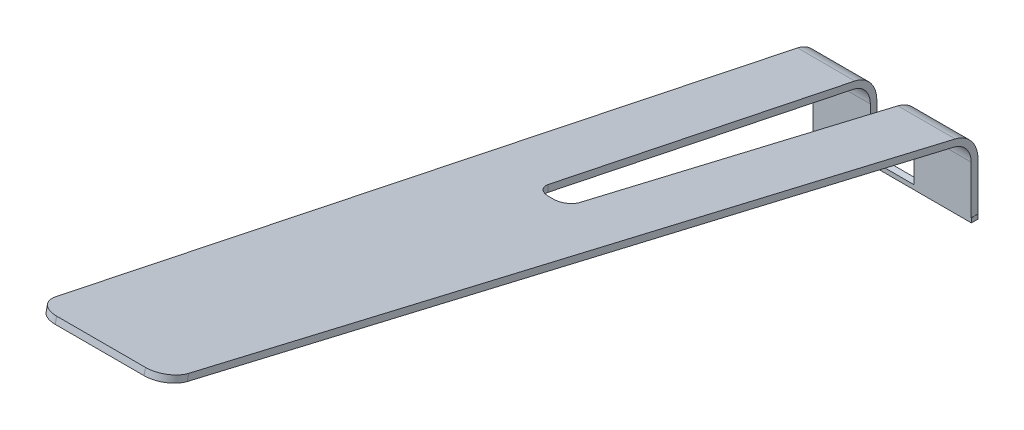
ISO-10303-21;
HEADER;
FILE_DESCRIPTION(('STEP AP214'),'2;1');
FILE_NAME('part.step','',(''),(''),'','','');
FILE_SCHEMA(('AUTOMOTIVE_DESIGN { 1 0 10303 214 1 1 1 1 }'));
ENDSEC;
DATA;
#1=APPLICATION_CONTEXT('core data for automotive mechanical design processes');
#2=APPLICATION_PROTOCOL_DEFINITION('international standard','automotive_design',2000,#1);
#3=PRODUCT_CONTEXT('',#1,'mechanical');
#4=PRODUCT('Part','Part','',(#3));
#5=PRODUCT_RELATED_PRODUCT_CATEGORY('part','',(#4));
#6=PRODUCT_DEFINITION_FORMATION('','',#4);
#7=PRODUCT_DEFINITION_CONTEXT('part definition',#1,'design');
#8=PRODUCT_DEFINITION('design','',#6,#7);
#9=PRODUCT_DEFINITION_SHAPE('','',#8);
#10=(LENGTH_UNIT() NAMED_UNIT(*) SI_UNIT(.MILLI.,.METRE.));
#11=(NAMED_UNIT(*) PLANE_ANGLE_UNIT() SI_UNIT($,.RADIAN.));
#12=(NAMED_UNIT(*) SI_UNIT($,.STERADIAN.) SOLID_ANGLE_UNIT());
#13=UNCERTAINTY_MEASURE_WITH_UNIT(LENGTH_MEASURE(1.E-05),#10,'distance_accuracy_value','');
#14=(GEOMETRIC_REPRESENTATION_CONTEXT(3) GLOBAL_UNCERTAINTY_ASSIGNED_CONTEXT((#13)) GLOBAL_UNIT_ASSIGNED_CONTEXT((#10,
#11,#12)) REPRESENTATION_CONTEXT('',''));
#15=CARTESIAN_POINT('',(0.,0.,0.));
#16=DIRECTION('',(0.,0.,1.));
#17=DIRECTION('',(1.,0.,0.));
#18=AXIS2_PLACEMENT_3D('',#15,#16,#17);
#19=CARTESIAN_POINT('',(1.05,6.67729537923709,-5.19121403275844));
#20=DIRECTION('',(0.,0.9761154710916,-0.217252358089902));
#21=DIRECTION('',(0.,0.217252358089902,0.9761154710916));
#22=AXIS2_PLACEMENT_3D('',#19,#20,#21);
#23=PLANE('',#22);
#24=DIRECTION('',(1.,0.,0.));
#25=VECTOR('',#24,1.);
#26=CARTESIAN_POINT('',(1.05,10.5964173206637,12.4174121462865));
#27=LINE('',#26,#25);
#28=CARTESIAN_POINT('',(1.84150899269365,10.5964173206637,12.4174121462865));
#29=VERTEX_POINT('',#28);
#30=CARTESIAN_POINT('',(3.85849100730636,10.5964173206637,12.4174121462865));
#31=VERTEX_POINT('',#30);
#32=EDGE_CURVE('E340',#29,#31,#27,.T.);
#33=ORIENTED_EDGE('',*,*,#32,.T.);
#34=CARTESIAN_POINT('',(3.85849100730636,10.4877911416188,11.9293544107407));
#35=DIRECTION('',(0.,0.9761154710916,-0.217252358089902));
#36=DIRECTION('',(1.,1.12114736717854E-12,5.03731835225337E-12));
#37=AXIS2_PLACEMENT_3D('',#34,#35,#36);
#38=ELLIPSE('',#37,0.500003188485115,0.5);
#39=CARTESIAN_POINT('',(4.35842984223507,10.4895338929215,11.937184597367));
#40=VERTEX_POINT('',#39);
#41=EDGE_CURVE('E47',#31,#40,#38,.T.);
#42=ORIENTED_EDGE('',*,*,#41,.T.);
#43=DIRECTION('',(0.0160436685581371,-0.217224395987895,-0.975989837286686));
#44=VECTOR('',#43,1.);
#45=CARTESIAN_POINT('',(4.63906849786791,6.68980677690716,-5.13500028696481));
#46=LINE('',#45,#44);
#47=CARTESIAN_POINT('',(4.6399925594426,6.67729537923709,-5.19121403275844));
#48=VERTEX_POINT('',#47);
#49=EDGE_CURVE('E246',#40,#48,#46,.T.);
#50=ORIENTED_EDGE('',*,*,#49,.T.);
#51=DIRECTION('',(1.,0.,0.));
#52=VECTOR('',#51,1.);
#53=CARTESIAN_POINT('',(1.05,6.67729537923709,-5.19121403275844));
#54=LINE('',#53,#52);
#55=CARTESIAN_POINT('',(3.33858526311422,6.67729537923709,-5.19121403275844));
#56=VERTEX_POINT('',#55);
#57=EDGE_CURVE('E341',#56,#48,#54,.T.);
#58=ORIENTED_EDGE('',*,*,#57,.F.);
#59=DIRECTION('',(-0.0182991005216206,0.217215980799233,0.975952027819773));
#60=VECTOR('',#59,1.);
#61=CARTESIAN_POINT('',(3.33781891413591,6.68639217854486,-5.1503420872486));
#62=LINE('',#61,#60);
#63=CARTESIAN_POINT('',(3.20551954978455,8.25682653693007,1.9056240114911));
#64=VERTEX_POINT('',#63);
#65=EDGE_CURVE('E306',#56,#64,#62,.T.);
#66=ORIENTED_EDGE('',*,*,#65,.T.);
#67=CARTESIAN_POINT('',(2.90557227025905,8.25557481027011,1.9));
#68=DIRECTION('',(0.,0.9761154710916,-0.217252358089902));
#69=DIRECTION('',(0.,-0.217252358089902,-0.9761154710916));
#70=AXIS2_PLACEMENT_3D('',#67,#68,#69);
#71=ELLIPSE('',#70,0.307340687536186,0.3);
#72=CARTESIAN_POINT('',(2.90557227025905,8.32234529937432,2.2));
#73=VERTEX_POINT('',#72);
#74=EDGE_CURVE('E310',#64,#73,#71,.F.);
#75=ORIENTED_EDGE('',*,*,#74,.T.);
#76=DIRECTION('',(-1.,0.,0.));
#77=VECTOR('',#76,1.);
#78=CARTESIAN_POINT('',(1.05,8.32234529937432,2.2));
#79=LINE('',#78,#77);
#80=CARTESIAN_POINT('',(2.79442772974096,8.32234529937432,2.2));
#81=VERTEX_POINT('',#80);
#82=EDGE_CURVE('E267',#73,#81,#79,.T.);
#83=ORIENTED_EDGE('',*,*,#82,.T.);
#84=CARTESIAN_POINT('',(2.79442772974096,8.25557481027011,1.9));
#85=DIRECTION('',(0.,0.9761154710916,-0.217252358089902));
#86=DIRECTION('',(0.,-0.217252358089902,-0.9761154710916));
#87=AXIS2_PLACEMENT_3D('',#84,#85,#86);
#88=ELLIPSE('',#87,0.307340687536186,0.3);
#89=CARTESIAN_POINT('',(2.49448045021546,8.25682653693007,1.9056240114911));
#90=VERTEX_POINT('',#89);
#91=EDGE_CURVE('E271',#81,#90,#88,.F.);
#92=ORIENTED_EDGE('',*,*,#91,.T.);
#93=DIRECTION('',(-0.0182991005216208,-0.217215980799233,-0.975952027819773));
#94=VECTOR('',#93,1.);
#95=CARTESIAN_POINT('',(2.36097560037645,6.67208269310169,-5.21463464658947));
#96=LINE('',#95,#94);
#97=CARTESIAN_POINT('',(2.36141473688578,6.67729537923709,-5.19121403275844));
#98=VERTEX_POINT('',#97);
#99=EDGE_CURVE('E289',#90,#98,#96,.T.);
#100=ORIENTED_EDGE('',*,*,#99,.T.);
#101=CARTESIAN_POINT('',(1.0600074405574,6.67729537923709,-5.19121403275844));
#102=VERTEX_POINT('',#101);
#103=EDGE_CURVE('E345',#102,#98,#54,.T.);
#104=ORIENTED_EDGE('',*,*,#103,.F.);
#105=DIRECTION('',(0.0160436685581373,0.217224395987895,0.975989837286686));
#106=VECTOR('',#105,1.);
#107=CARTESIAN_POINT('',(1.0600048646492,6.67726050254406,-5.19137073384074));
#108=LINE('',#107,#106);
#109=CARTESIAN_POINT('',(1.34157015776494,10.4895338929215,11.937184597367));
#110=VERTEX_POINT('',#109);
#111=EDGE_CURVE('E255',#102,#110,#108,.T.);
#112=ORIENTED_EDGE('',*,*,#111,.T.);
#113=CARTESIAN_POINT('',(1.84150899269365,10.4877911416188,11.9293544107407));
#114=DIRECTION('',(0.,0.9761154710916,-0.217252358089902));
#115=DIRECTION('',(1.,-1.12114736717852E-12,-5.03731835225329E-12));
#116=AXIS2_PLACEMENT_3D('',#113,#114,#115);
#117=ELLIPSE('',#116,0.500003188485115,0.5);
#118=EDGE_CURVE('E54',#110,#29,#117,.T.);
#119=ORIENTED_EDGE('',*,*,#118,.T.);
#120=EDGE_LOOP('',(#33,#42,#50,#58,#66,#75,#83,#92,#100,#104,#112,#119));
#121=FACE_BOUND('',#120,.T.);
#122=ADVANCED_FACE('F38',(#121),#23,.T.);
#123=CARTESIAN_POINT('',(1.05,6.04282032302755,-5.05));
#124=DIRECTION('',(1.,0.,0.));
#125=DIRECTION('',(0.,0.,-1.));
#126=AXIS2_PLACEMENT_3D('',#123,#124,#125);
#127=CYLINDRICAL_SURFACE('',#126,0.650000000000001);
#128=DIRECTION('',(1.,0.,0.));
#129=VECTOR('',#128,1.);
#130=CARTESIAN_POINT('',(1.05,6.04282032302755,-5.7));
#131=LINE('',#130,#129);
#132=CARTESIAN_POINT('',(1.05164383561644,6.04282032302755,-5.7));
#133=VERTEX_POINT('',#132);
#134=CARTESIAN_POINT('',(2.351875,6.04282032302755,-5.7));
#135=VERTEX_POINT('',#134);
#136=EDGE_CURVE('E346',#133,#135,#131,.T.);
#137=ORIENTED_EDGE('',*,*,#136,.F.);
#138=CARTESIAN_POINT('',(1.06232876712329,6.04282032302755,-5.05));
#139=DIRECTION('',(-0.99986491759912,0.,0.0164361356317664));
#140=DIRECTION('',(0.0164361356317664,0.,0.99986491759912));
#141=AXIS2_PLACEMENT_3D('',#138,#139,#140);
#142=ELLIPSE('',#141,0.650087815422891,0.650000000000001);
#143=EDGE_CURVE('E259',#133,#102,#142,.F.);
#144=ORIENTED_EDGE('',*,*,#143,.T.);
#145=ORIENTED_EDGE('',*,*,#103,.T.);
#146=CARTESIAN_POINT('',(2.3640625,6.04282032302755,-5.05));
#147=DIRECTION('',(0.999824265084997,0.,-0.0187467049703437));
#148=DIRECTION('',(0.0187467049703437,0.,0.999824265084997));
#149=AXIS2_PLACEMENT_3D('',#146,#147,#148);
#150=ELLIPSE('',#149,0.650114247772075,0.650000000000001);
#151=EDGE_CURVE('E285',#98,#135,#150,.F.);
#152=ORIENTED_EDGE('',*,*,#151,.T.);
#153=EDGE_LOOP('',(#137,#144,#145,#152));
#154=FACE_BOUND('',#153,.T.);
#155=ADVANCED_FACE('F498',(#154),#127,.T.);
#156=ORIENTED_EDGE('',*,*,#57,.T.);
#157=CARTESIAN_POINT('',(4.63767123287671,6.04282032302755,-5.05));
#158=DIRECTION('',(0.99986491759912,0.,0.0164361356317661));
#159=DIRECTION('',(0.0164361356317661,0.,-0.99986491759912));
#160=AXIS2_PLACEMENT_3D('',#157,#158,#159);
#161=ELLIPSE('',#160,0.650087815422891,0.650000000000001);
#162=CARTESIAN_POINT('',(4.64835616438356,6.04282032302755,-5.7));
#163=VERTEX_POINT('',#162);
#164=EDGE_CURVE('E237',#48,#163,#161,.F.);
#165=ORIENTED_EDGE('',*,*,#164,.T.);
#166=CARTESIAN_POINT('',(3.348125,6.04282032302755,-5.7));
#167=VERTEX_POINT('',#166);
#168=EDGE_CURVE('E234',#167,#163,#131,.T.);
#169=ORIENTED_EDGE('',*,*,#168,.F.);
#170=CARTESIAN_POINT('',(3.3359375,6.04282032302755,-5.05));
#171=DIRECTION('',(-0.999824265084997,0.,-0.0187467049703435));
#172=DIRECTION('',(0.0187467049703435,0.,-0.999824265084997));
#173=AXIS2_PLACEMENT_3D('',#170,#171,#172);
#174=ELLIPSE('',#173,0.650114247772075,0.650000000000001);
#175=EDGE_CURVE('E302',#167,#56,#174,.F.);
#176=ORIENTED_EDGE('',*,*,#175,.T.);
#177=EDGE_LOOP('',(#156,#165,#169,#176));
#178=FACE_BOUND('',#177,.T.);
#179=ADVANCED_FACE('F496',(#178),#127,.T.);
#180=CARTESIAN_POINT('',(1.05,4.85,-5.7));
#181=DIRECTION('',(0.,0.,-1.));
#182=DIRECTION('',(0.,1.,0.));
#183=AXIS2_PLACEMENT_3D('',#180,#181,#182);
#184=PLANE('',#183);
#185=DIRECTION('',(1.,0.,0.));
#186=VECTOR('',#185,1.);
#187=CARTESIAN_POINT('',(1.05,4.95,-5.7));
#188=LINE('',#187,#186);
#189=CARTESIAN_POINT('',(1.05,4.95,-5.7));
#190=VERTEX_POINT('',#189);
#191=CARTESIAN_POINT('',(1.05164383561644,4.95,-5.7));
#192=VERTEX_POINT('',#191);
#193=EDGE_CURVE('E450',#190,#192,#188,.T.);
#194=ORIENTED_EDGE('',*,*,#193,.T.);
#195=DIRECTION('',(0.,1.,0.));
#196=VECTOR('',#195,1.);
#197=CARTESIAN_POINT('',(1.05164383561644,4.85,-5.7));
#198=LINE('',#197,#196);
#199=EDGE_CURVE('E263',#192,#133,#198,.T.);
#200=ORIENTED_EDGE('',*,*,#199,.T.);
#201=ORIENTED_EDGE('',*,*,#136,.T.);
#202=DIRECTION('',(0.,-1.,0.));
#203=VECTOR('',#202,1.);
#204=CARTESIAN_POINT('',(2.351875,4.85,-5.7));
#205=LINE('',#204,#203);
#206=CARTESIAN_POINT('',(2.351875,4.95,-5.7));
#207=VERTEX_POINT('',#206);
#208=EDGE_CURVE('E281',#135,#207,#205,.T.);
#209=ORIENTED_EDGE('',*,*,#208,.T.);
#210=DIRECTION('',(1.,0.,0.));
#211=VECTOR('',#210,1.);
#212=CARTESIAN_POINT('',(1.05,4.95,-5.7));
#213=LINE('',#212,#211);
#214=CARTESIAN_POINT('',(3.348125,4.95,-5.7));
#215=VERTEX_POINT('',#214);
#216=EDGE_CURVE('E314',#207,#215,#213,.T.);
#217=ORIENTED_EDGE('',*,*,#216,.T.);
#218=DIRECTION('',(0.,1.,0.));
#219=VECTOR('',#218,1.);
#220=CARTESIAN_POINT('',(3.348125,4.85,-5.7));
#221=LINE('',#220,#219);
#222=EDGE_CURVE('E299',#215,#167,#221,.T.);
#223=ORIENTED_EDGE('',*,*,#222,.T.);
#224=ORIENTED_EDGE('',*,*,#168,.T.);
#225=DIRECTION('',(0.,-1.,0.));
#226=VECTOR('',#225,1.);
#227=CARTESIAN_POINT('',(4.64835616438356,4.85,-5.7));
#228=LINE('',#227,#226);
#229=CARTESIAN_POINT('',(4.64835616438356,4.95,-5.7));
#230=VERTEX_POINT('',#229);
#231=EDGE_CURVE('E221',#163,#230,#228,.T.);
#232=ORIENTED_EDGE('',*,*,#231,.T.);
#233=DIRECTION('',(1.,0.,0.));
#234=VECTOR('',#233,1.);
#235=CARTESIAN_POINT('',(1.05,4.95,-5.7));
#236=LINE('',#235,#234);
#237=CARTESIAN_POINT('',(4.65,4.95,-5.7));
#238=VERTEX_POINT('',#237);
#239=EDGE_CURVE('E202',#230,#238,#236,.T.);
#240=ORIENTED_EDGE('',*,*,#239,.T.);
#241=DIRECTION('',(0.,1.,0.));
#242=VECTOR('',#241,1.);
#243=CARTESIAN_POINT('',(4.65,4.85,-5.7));
#244=LINE('',#243,#242);
#245=CARTESIAN_POINT('',(4.65,4.85,-5.7));
#246=VERTEX_POINT('',#245);
#247=EDGE_CURVE('E326',#246,#238,#244,.T.);
#248=ORIENTED_EDGE('',*,*,#247,.F.);
#249=DIRECTION('',(1.,0.,0.));
#250=VECTOR('',#249,1.);
#251=CARTESIAN_POINT('',(1.05,4.85,-5.7));
#252=LINE('',#251,#250);
#253=CARTESIAN_POINT('',(1.05,4.85,-5.7));
#254=VERTEX_POINT('',#253);
#255=EDGE_CURVE('E349',#254,#246,#252,.T.);
#256=ORIENTED_EDGE('',*,*,#255,.F.);
#257=DIRECTION('',(0.,1.,0.));
#258=VECTOR('',#257,1.);
#259=CARTESIAN_POINT('',(1.05,4.85,-5.7));
#260=LINE('',#259,#258);
#261=EDGE_CURVE('E336',#254,#190,#260,.T.);
#262=ORIENTED_EDGE('',*,*,#261,.T.);
#263=EDGE_LOOP('',(#194,#200,#201,#209,#217,#223,#224,#232,#240,#248,#256,#262));
#264=FACE_BOUND('',#263,.T.);
#265=ADVANCED_FACE('F231',(#264),#184,.T.);
#266=CARTESIAN_POINT('',(1.05,4.85,-5.55));
#267=DIRECTION('',(0.,0.,-1.));
#268=DIRECTION('',(0.,1.,0.));
#269=AXIS2_PLACEMENT_3D('',#266,#267,#268);
#270=PLANE('',#269);
#271=DIRECTION('',(0.,1.,0.));
#272=VECTOR('',#271,1.);
#273=CARTESIAN_POINT('',(1.0541095890411,4.85,-5.55));
#274=LINE('',#273,#272);
#275=CARTESIAN_POINT('',(1.0541095890411,4.95,-5.55));
#276=VERTEX_POINT('',#275);
#277=CARTESIAN_POINT('',(1.0541095890411,6.04282032302755,-5.55));
#278=VERTEX_POINT('',#277);
#279=EDGE_CURVE('E252',#276,#278,#274,.T.);
#280=ORIENTED_EDGE('',*,*,#279,.F.);
#281=DIRECTION('',(1.,0.,0.));
#282=VECTOR('',#281,1.);
#283=CARTESIAN_POINT('',(1.05,4.95,-5.55));
#284=LINE('',#283,#282);
#285=CARTESIAN_POINT('',(1.05,4.95,-5.55));
#286=VERTEX_POINT('',#285);
#287=EDGE_CURVE('E214',#286,#276,#284,.T.);
#288=ORIENTED_EDGE('',*,*,#287,.F.);
#289=DIRECTION('',(0.,1.,0.));
#290=VECTOR('',#289,1.);
#291=CARTESIAN_POINT('',(1.05,4.85,-5.55));
#292=LINE('',#291,#290);
#293=CARTESIAN_POINT('',(1.05,4.85,-5.55));
#294=VERTEX_POINT('',#293);
#295=EDGE_CURVE('E329',#294,#286,#292,.T.);
#296=ORIENTED_EDGE('',*,*,#295,.F.);
#297=DIRECTION('',(1.,0.,0.));
#298=VECTOR('',#297,1.);
#299=CARTESIAN_POINT('',(1.05,4.85,-5.55));
#300=LINE('',#299,#298);
#301=CARTESIAN_POINT('',(4.65,4.85,-5.55));
#302=VERTEX_POINT('',#301);
#303=EDGE_CURVE('E352',#294,#302,#300,.T.);
#304=ORIENTED_EDGE('',*,*,#303,.T.);
#305=DIRECTION('',(0.,1.,0.));
#306=VECTOR('',#305,1.);
#307=CARTESIAN_POINT('',(4.65,4.85,-5.55));
#308=LINE('',#307,#306);
#309=CARTESIAN_POINT('',(4.65,4.95,-5.55));
#310=VERTEX_POINT('',#309);
#311=EDGE_CURVE('E318',#302,#310,#308,.T.);
#312=ORIENTED_EDGE('',*,*,#311,.T.);
#313=DIRECTION('',(1.,0.,0.));
#314=VECTOR('',#313,1.);
#315=CARTESIAN_POINT('',(1.05,4.95,-5.55));
#316=LINE('',#315,#314);
#317=CARTESIAN_POINT('',(4.6458904109589,4.95,-5.55));
#318=VERTEX_POINT('',#317);
#319=EDGE_CURVE('E215',#318,#310,#316,.T.);
#320=ORIENTED_EDGE('',*,*,#319,.F.);
#321=DIRECTION('',(0.,-1.,0.));
#322=VECTOR('',#321,1.);
#323=CARTESIAN_POINT('',(4.6458904109589,4.85,-5.55));
#324=LINE('',#323,#322);
#325=CARTESIAN_POINT('',(4.6458904109589,6.04282032302755,-5.55));
#326=VERTEX_POINT('',#325);
#327=EDGE_CURVE('E224',#326,#318,#324,.T.);
#328=ORIENTED_EDGE('',*,*,#327,.F.);
#329=DIRECTION('',(1.,0.,0.));
#330=VECTOR('',#329,1.);
#331=CARTESIAN_POINT('',(1.05,6.04282032302755,-5.55));
#332=LINE('',#331,#330);
#333=CARTESIAN_POINT('',(3.3453125,6.04282032302755,-5.55));
#334=VERTEX_POINT('',#333);
#335=EDGE_CURVE('E356',#334,#326,#332,.T.);
#336=ORIENTED_EDGE('',*,*,#335,.F.);
#337=DIRECTION('',(0.,1.,0.));
#338=VECTOR('',#337,1.);
#339=CARTESIAN_POINT('',(3.3453125,4.85,-5.55));
#340=LINE('',#339,#338);
#341=CARTESIAN_POINT('',(3.3453125,4.95,-5.55));
#342=VERTEX_POINT('',#341);
#343=EDGE_CURVE('E296',#342,#334,#340,.T.);
#344=ORIENTED_EDGE('',*,*,#343,.F.);
#345=DIRECTION('',(1.,0.,0.));
#346=VECTOR('',#345,1.);
#347=CARTESIAN_POINT('',(1.05,4.95,-5.55));
#348=LINE('',#347,#346);
#349=CARTESIAN_POINT('',(2.3546875,4.95,-5.55));
#350=VERTEX_POINT('',#349);
#351=EDGE_CURVE('E391',#350,#342,#348,.T.);
#352=ORIENTED_EDGE('',*,*,#351,.F.);
#353=DIRECTION('',(0.,-1.,0.));
#354=VECTOR('',#353,1.);
#355=CARTESIAN_POINT('',(2.3546875,4.85,-5.55));
#356=LINE('',#355,#354);
#357=CARTESIAN_POINT('',(2.3546875,6.04282032302755,-5.55));
#358=VERTEX_POINT('',#357);
#359=EDGE_CURVE('E278',#358,#350,#356,.T.);
#360=ORIENTED_EDGE('',*,*,#359,.F.);
#361=EDGE_CURVE('E355',#278,#358,#332,.T.);
#362=ORIENTED_EDGE('',*,*,#361,.F.);
#363=EDGE_LOOP('',(#280,#288,#296,#304,#312,#320,#328,#336,#344,#352,#360,#362));
#364=FACE_BOUND('',#363,.T.);
#365=ADVANCED_FACE('F439',(#364),#270,.F.);
#366=CARTESIAN_POINT('',(1.05,6.04282032302755,-5.05));
#367=DIRECTION('',(1.,0.,0.));
#368=DIRECTION('',(0.,0.,-1.));
#369=AXIS2_PLACEMENT_3D('',#366,#367,#368);
#370=CYLINDRICAL_SURFACE('',#369,0.500000000000001);
#371=CARTESIAN_POINT('',(1.06232876712329,6.04282032302755,-5.05));
#372=DIRECTION('',(-0.99986491759912,0.,0.0164361356317664));
#373=DIRECTION('',(0.0164361356317664,0.,0.99986491759912));
#374=AXIS2_PLACEMENT_3D('',#371,#372,#373);
#375=ELLIPSE('',#374,0.500067550325301,0.500000000000001);
#376=CARTESIAN_POINT('',(1.06054313130337,6.53087805857335,-5.15862617904495));
#377=VERTEX_POINT('',#376);
#378=EDGE_CURVE('E243',#278,#377,#375,.F.);
#379=ORIENTED_EDGE('',*,*,#378,.F.);
#380=ORIENTED_EDGE('',*,*,#361,.T.);
#381=CARTESIAN_POINT('',(2.3640625,6.04282032302755,-5.05));
#382=DIRECTION('',(0.999824265084997,0.,-0.0187467049703437));
#383=DIRECTION('',(0.0187467049703437,0.,0.999824265084997));
#384=AXIS2_PLACEMENT_3D('',#381,#382,#383);
#385=ELLIPSE('',#384,0.500087882901596,0.500000000000001);
#386=CARTESIAN_POINT('',(2.36202575914291,6.53087805857335,-5.15862617904495));
#387=VERTEX_POINT('',#386);
#388=EDGE_CURVE('E275',#387,#358,#385,.F.);
#389=ORIENTED_EDGE('',*,*,#388,.F.);
#390=DIRECTION('',(1.,0.,0.));
#391=VECTOR('',#390,1.);
#392=CARTESIAN_POINT('',(1.05,6.53087805857335,-5.15862617904495));
#393=LINE('',#392,#391);
#394=EDGE_CURVE('E360',#377,#387,#393,.T.);
#395=ORIENTED_EDGE('',*,*,#394,.F.);
#396=EDGE_LOOP('',(#379,#380,#389,#395));
#397=FACE_BOUND('',#396,.T.);
#398=ADVANCED_FACE('F435',(#397),#370,.F.);
#399=CARTESIAN_POINT('',(4.63767123287671,6.04282032302755,-5.05));
#400=DIRECTION('',(0.99986491759912,0.,0.0164361356317661));
#401=DIRECTION('',(0.0164361356317661,0.,-0.99986491759912));
#402=AXIS2_PLACEMENT_3D('',#399,#400,#401);
#403=ELLIPSE('',#402,0.500067550325301,0.500000000000001);
#404=CARTESIAN_POINT('',(4.63945686869663,6.53087805857335,-5.15862617904495));
#405=VERTEX_POINT('',#404);
#406=EDGE_CURVE('E453',#405,#326,#403,.F.);
#407=ORIENTED_EDGE('',*,*,#406,.F.);
#408=CARTESIAN_POINT('',(3.33797424085709,6.53087805857335,-5.15862617904495));
#409=VERTEX_POINT('',#408);
#410=EDGE_CURVE('E361',#409,#405,#393,.T.);
#411=ORIENTED_EDGE('',*,*,#410,.F.);
#412=CARTESIAN_POINT('',(3.3359375,6.04282032302755,-5.05));
#413=DIRECTION('',(-0.999824265084997,0.,-0.0187467049703435));
#414=DIRECTION('',(0.0187467049703435,0.,-0.999824265084997));
#415=AXIS2_PLACEMENT_3D('',#412,#413,#414);
#416=ELLIPSE('',#415,0.500087882901596,0.500000000000001);
#417=EDGE_CURVE('E293',#334,#409,#416,.F.);
#418=ORIENTED_EDGE('',*,*,#417,.F.);
#419=ORIENTED_EDGE('',*,*,#335,.T.);
#420=EDGE_LOOP('',(#407,#411,#418,#419));
#421=FACE_BOUND('',#420,.T.);
#422=ADVANCED_FACE('F482',(#421),#370,.F.);
#423=CARTESIAN_POINT('',(1.05,6.53087805857335,-5.15862617904495));
#424=DIRECTION('',(0.,0.9761154710916,-0.217252358089902));
#425=DIRECTION('',(0.,0.217252358089902,0.9761154710916));
#426=AXIS2_PLACEMENT_3D('',#423,#424,#425);
#427=PLANE('',#426);
#428=DIRECTION('',(0.0160436685581371,-0.217224395987895,-0.975989837286685));
#429=VECTOR('',#428,1.);
#430=CARTESIAN_POINT('',(4.63853294500836,6.54338758932034,-5.10242082134208));
#431=LINE('',#430,#429);
#432=CARTESIAN_POINT('',(4.35789415148909,10.3431165722578,11.9697724510805));
#433=VERTEX_POINT('',#432);
#434=EDGE_CURVE('E422',#433,#405,#431,.T.);
#435=ORIENTED_EDGE('',*,*,#434,.F.);
#436=CARTESIAN_POINT('',(3.85795531656039,10.341373820955,11.9619422644542));
#437=DIRECTION('',(0.,0.9761154710916,-0.217252358089902));
#438=DIRECTION('',(1.,1.12114736717854E-12,5.03731835225337E-12));
#439=AXIS2_PLACEMENT_3D('',#436,#437,#438);
#440=ELLIPSE('',#439,0.500003188485115,0.5);
#441=CARTESIAN_POINT('',(3.85795531656039,10.45,12.45));
#442=VERTEX_POINT('',#441);
#443=EDGE_CURVE('E401',#433,#442,#440,.F.);
#444=ORIENTED_EDGE('',*,*,#443,.T.);
#445=DIRECTION('',(1.,0.,0.));
#446=VECTOR('',#445,1.);
#447=CARTESIAN_POINT('',(1.05,10.45,12.45));
#448=LINE('',#447,#446);
#449=CARTESIAN_POINT('',(1.84204468343962,10.45,12.45));
#450=VERTEX_POINT('',#449);
#451=EDGE_CURVE('E365',#450,#442,#448,.T.);
#452=ORIENTED_EDGE('',*,*,#451,.F.);
#453=CARTESIAN_POINT('',(1.84204468343962,10.341373820955,11.9619422644542));
#454=DIRECTION('',(0.,0.9761154710916,-0.217252358089902));
#455=DIRECTION('',(1.,-1.12114736717852E-12,-5.03731835225329E-12));
#456=AXIS2_PLACEMENT_3D('',#453,#454,#455);
#457=ELLIPSE('',#456,0.500003188485115,0.5);
#458=CARTESIAN_POINT('',(1.34210584851092,10.3431165722578,11.9697724510805));
#459=VERTEX_POINT('',#458);
#460=EDGE_CURVE('E398',#450,#459,#457,.F.);
#461=ORIENTED_EDGE('',*,*,#460,.T.);
#462=DIRECTION('',(0.0160436685581373,0.217224395987895,0.975989837286685));
#463=VECTOR('',#462,1.);
#464=CARTESIAN_POINT('',(1.06054041750875,6.53084131495724,-5.15879126821802));
#465=LINE('',#464,#463);
#466=EDGE_CURVE('E236',#377,#459,#465,.T.);
#467=ORIENTED_EDGE('',*,*,#466,.F.);
#468=ORIENTED_EDGE('',*,*,#394,.T.);
#469=DIRECTION('',(-0.0182991005216208,-0.217215980799233,-0.975952027819773));
#470=VECTOR('',#469,1.);
#471=CARTESIAN_POINT('',(2.36158641802845,6.52566294371182,-5.18205770514952));
#472=LINE('',#471,#470);
#473=CARTESIAN_POINT('',(2.49448045021546,8.10315619316198,1.9056240114911));
#474=VERTEX_POINT('',#473);
#475=EDGE_CURVE('E381',#474,#387,#472,.T.);
#476=ORIENTED_EDGE('',*,*,#475,.F.);
#477=CARTESIAN_POINT('',(2.79442772974096,8.10190446650202,1.9));
#478=DIRECTION('',(0.,0.9761154710916,-0.217252358089902));
#479=DIRECTION('',(0.,-0.217252358089902,-0.9761154710916));
#480=AXIS2_PLACEMENT_3D('',#477,#478,#479);
#481=ELLIPSE('',#480,0.307340687536186,0.3);
#482=CARTESIAN_POINT('',(2.79442772974096,8.16867495560622,2.2));
#483=VERTEX_POINT('',#482);
#484=EDGE_CURVE('E378',#483,#474,#481,.F.);
#485=ORIENTED_EDGE('',*,*,#484,.F.);
#486=DIRECTION('',(-1.,0.,0.));
#487=VECTOR('',#486,1.);
#488=CARTESIAN_POINT('',(1.05,8.16867495560622,2.2));
#489=LINE('',#488,#487);
#490=CARTESIAN_POINT('',(2.90557227025905,8.16867495560622,2.2));
#491=VERTEX_POINT('',#490);
#492=EDGE_CURVE('E375',#491,#483,#489,.T.);
#493=ORIENTED_EDGE('',*,*,#492,.F.);
#494=CARTESIAN_POINT('',(2.90557227025905,8.10190446650202,1.9));
#495=DIRECTION('',(0.,0.9761154710916,-0.217252358089902));
#496=DIRECTION('',(0.,-0.217252358089902,-0.9761154710916));
#497=AXIS2_PLACEMENT_3D('',#494,#495,#496);
#498=ELLIPSE('',#497,0.307340687536186,0.3);
#499=CARTESIAN_POINT('',(3.20551954978455,8.10315619316198,1.9056240114911));
#500=VERTEX_POINT('',#499);
#501=EDGE_CURVE('E384',#500,#491,#498,.F.);
#502=ORIENTED_EDGE('',*,*,#501,.F.);
#503=DIRECTION('',(-0.0182991005216206,0.217215980799233,0.975952027819773));
#504=VECTOR('',#503,1.);
#505=CARTESIAN_POINT('',(3.33720809648391,6.53997242915499,-5.11776514580865));
#506=LINE('',#505,#504);
#507=EDGE_CURVE('E388',#409,#500,#506,.T.);
#508=ORIENTED_EDGE('',*,*,#507,.F.);
#509=ORIENTED_EDGE('',*,*,#410,.T.);
#510=EDGE_LOOP('',(#435,#444,#452,#461,#467,#468,#476,#485,#493,#502,#508,#509));
#511=FACE_BOUND('',#510,.T.);
#512=ADVANCED_FACE('F420',(#511),#427,.F.);
#513=CARTESIAN_POINT('',(1.05,10.45,12.45));
#514=DIRECTION('',(0.,-0.217252358089884,-0.976115471091604));
#515=DIRECTION('',(0.,0.976115471091604,-0.217252358089884));
#516=AXIS2_PLACEMENT_3D('',#513,#514,#515);
#517=PLANE('',#516);
#518=ORIENTED_EDGE('',*,*,#451,.T.);
#519=DIRECTION('',(-0.00357124886608596,-0.976109246471999,0.217250972686899));
#520=VECTOR('',#519,1.);
#521=CARTESIAN_POINT('',(3.85849728275493,10.5981325535145,12.4170303898319));
#522=LINE('',#521,#520);
#523=EDGE_CURVE('E61',#442,#31,#522,.F.);
#524=ORIENTED_EDGE('',*,*,#523,.T.);
#525=ORIENTED_EDGE('',*,*,#32,.F.);
#526=DIRECTION('',(-0.00357124886608602,0.976109246471999,-0.217250972686899));
#527=VECTOR('',#526,1.);
#528=CARTESIAN_POINT('',(1.84203840799105,10.4517152328508,12.4496182435454));
#529=LINE('',#528,#527);
#530=EDGE_CURVE('E404',#29,#450,#529,.F.);
#531=ORIENTED_EDGE('',*,*,#530,.T.);
#532=EDGE_LOOP('',(#518,#524,#525,#531));
#533=FACE_BOUND('',#532,.T.);
#534=ADVANCED_FACE('F423',(#533),#517,.F.);
#535=CARTESIAN_POINT('',(1.05,6.04282032302755,-5.05));
#536=DIRECTION('',(1.,0.,0.));
#537=DIRECTION('',(0.,0.,-1.));
#538=AXIS2_PLACEMENT_3D('',#535,#536,#537);
#539=PLANE('',#538);
#540=DIRECTION('',(0.,0.,1.));
#541=VECTOR('',#540,1.);
#542=CARTESIAN_POINT('',(1.05,4.95,-5.05));
#543=LINE('',#542,#541);
#544=EDGE_CURVE('E372',#190,#286,#543,.T.);
#545=ORIENTED_EDGE('',*,*,#544,.F.);
#546=ORIENTED_EDGE('',*,*,#261,.F.);
#547=DIRECTION('',(0.,0.,1.));
#548=VECTOR('',#547,1.);
#549=CARTESIAN_POINT('',(1.05,4.85,-5.7));
#550=LINE('',#549,#548);
#551=EDGE_CURVE('E333',#254,#294,#550,.T.);
#552=ORIENTED_EDGE('',*,*,#551,.T.);
#553=ORIENTED_EDGE('',*,*,#295,.T.);
#554=EDGE_LOOP('',(#545,#546,#552,#553));
#555=FACE_BOUND('',#554,.T.);
#556=ADVANCED_FACE('F542',(#555),#539,.F.);
#557=CARTESIAN_POINT('',(4.65,6.04282032302755,-5.05));
#558=DIRECTION('',(1.,0.,0.));
#559=DIRECTION('',(0.,0.,-1.));
#560=AXIS2_PLACEMENT_3D('',#557,#558,#559);
#561=PLANE('',#560);
#562=ORIENTED_EDGE('',*,*,#247,.T.);
#563=DIRECTION('',(0.,0.,1.));
#564=VECTOR('',#563,1.);
#565=CARTESIAN_POINT('',(4.65,4.95,-5.05));
#566=LINE('',#565,#564);
#567=EDGE_CURVE('E208',#238,#310,#566,.T.);
#568=ORIENTED_EDGE('',*,*,#567,.T.);
#569=ORIENTED_EDGE('',*,*,#311,.F.);
#570=DIRECTION('',(0.,0.,1.));
#571=VECTOR('',#570,1.);
#572=CARTESIAN_POINT('',(4.65,4.85,-5.7));
#573=LINE('',#572,#571);
#574=EDGE_CURVE('E322',#246,#302,#573,.T.);
#575=ORIENTED_EDGE('',*,*,#574,.F.);
#576=EDGE_LOOP('',(#562,#568,#569,#575));
#577=FACE_BOUND('',#576,.T.);
#578=ADVANCED_FACE('F539',(#577),#561,.T.);
#579=CARTESIAN_POINT('',(1.05,4.85,-5.7));
#580=DIRECTION('',(0.,1.,0.));
#581=DIRECTION('',(0.,0.,1.));
#582=AXIS2_PLACEMENT_3D('',#579,#580,#581);
#583=PLANE('',#582);
#584=ORIENTED_EDGE('',*,*,#255,.T.);
#585=ORIENTED_EDGE('',*,*,#574,.T.);
#586=ORIENTED_EDGE('',*,*,#303,.F.);
#587=ORIENTED_EDGE('',*,*,#551,.F.);
#588=EDGE_LOOP('',(#584,#585,#586,#587));
#589=FACE_BOUND('',#588,.T.);
#590=ADVANCED_FACE('F541',(#589),#583,.F.);
#591=CARTESIAN_POINT('',(4.65,10.5964173206637,-5.8));
#592=DIRECTION('',(0.99986491759912,0.,0.0164361356317661));
#593=DIRECTION('',(0.0164361356317661,0.,-0.99986491759912));
#594=AXIS2_PLACEMENT_3D('',#591,#592,#593);
#595=PLANE('',#594);
#596=ORIENTED_EDGE('',*,*,#49,.F.);
#597=DIRECTION('',(-0.00357124886608596,-0.976109246471998,0.217250972686899));
#598=VECTOR('',#597,1.);
#599=CARTESIAN_POINT('',(4.35789405080852,10.3430890538059,11.9697785758155));
#600=LINE('',#599,#598);
#601=EDGE_CURVE('E394',#40,#433,#600,.T.);
#602=ORIENTED_EDGE('',*,*,#601,.T.);
#603=ORIENTED_EDGE('',*,*,#434,.T.);
#604=ORIENTED_EDGE('',*,*,#406,.T.);
#605=ORIENTED_EDGE('',*,*,#327,.T.);
#606=DIRECTION('',(-0.0164361356317661,0.,0.99986491759912));
#607=VECTOR('',#606,1.);
#608=CARTESIAN_POINT('',(4.65,4.95,-5.8));
#609=LINE('',#608,#607);
#610=EDGE_CURVE('E205',#230,#318,#609,.T.);
#611=ORIENTED_EDGE('',*,*,#610,.F.);
#612=ORIENTED_EDGE('',*,*,#231,.F.);
#613=ORIENTED_EDGE('',*,*,#164,.F.);
#614=EDGE_LOOP('',(#596,#602,#603,#604,#605,#611,#612,#613));
#615=FACE_BOUND('',#614,.T.);
#616=ADVANCED_FACE('F219',(#615),#595,.T.);
#617=CARTESIAN_POINT('',(0.,4.95,0.));
#618=DIRECTION('',(0.,1.,0.));
#619=DIRECTION('',(0.,0.,1.));
#620=AXIS2_PLACEMENT_3D('',#617,#618,#619);
#621=PLANE('',#620);
#622=ORIENTED_EDGE('',*,*,#610,.T.);
#623=ORIENTED_EDGE('',*,*,#319,.T.);
#624=ORIENTED_EDGE('',*,*,#567,.F.);
#625=ORIENTED_EDGE('',*,*,#239,.F.);
#626=EDGE_LOOP('',(#622,#623,#624,#625));
#627=FACE_BOUND('',#626,.T.);
#628=ADVANCED_FACE('F204',(#627),#621,.T.);
#629=CARTESIAN_POINT('',(1.05,10.5964173206637,-5.8));
#630=DIRECTION('',(-0.99986491759912,0.,0.0164361356317664));
#631=DIRECTION('',(0.0164361356317664,0.,0.99986491759912));
#632=AXIS2_PLACEMENT_3D('',#629,#630,#631);
#633=PLANE('',#632);
#634=ORIENTED_EDGE('',*,*,#466,.T.);
#635=DIRECTION('',(-0.00357124886608602,0.976109246471998,-0.217250972686899));
#636=VECTOR('',#635,1.);
#637=CARTESIAN_POINT('',(1.34157025844552,10.4895063744696,11.937190722102));
#638=LINE('',#637,#636);
#639=EDGE_CURVE('E11',#459,#110,#638,.T.);
#640=ORIENTED_EDGE('',*,*,#639,.T.);
#641=ORIENTED_EDGE('',*,*,#111,.F.);
#642=ORIENTED_EDGE('',*,*,#143,.F.);
#643=ORIENTED_EDGE('',*,*,#199,.F.);
#644=DIRECTION('',(-0.0164361356317664,0.,-0.99986491759912));
#645=VECTOR('',#644,1.);
#646=CARTESIAN_POINT('',(1.05,4.95,-5.8));
#647=LINE('',#646,#645);
#648=EDGE_CURVE('E226',#276,#192,#647,.T.);
#649=ORIENTED_EDGE('',*,*,#648,.F.);
#650=ORIENTED_EDGE('',*,*,#279,.T.);
#651=ORIENTED_EDGE('',*,*,#378,.T.);
#652=EDGE_LOOP('',(#634,#640,#641,#642,#643,#649,#650,#651));
#653=FACE_BOUND('',#652,.T.);
#654=ADVANCED_FACE('F428',(#653),#633,.T.);
#655=CARTESIAN_POINT('',(0.,4.95,0.));
#656=DIRECTION('',(0.,1.,0.));
#657=DIRECTION('',(0.,0.,1.));
#658=AXIS2_PLACEMENT_3D('',#655,#656,#657);
#659=PLANE('',#658);
#660=ORIENTED_EDGE('',*,*,#544,.T.);
#661=ORIENTED_EDGE('',*,*,#287,.T.);
#662=ORIENTED_EDGE('',*,*,#648,.T.);
#663=ORIENTED_EDGE('',*,*,#193,.F.);
#664=EDGE_LOOP('',(#660,#661,#662,#663));
#665=FACE_BOUND('',#664,.T.);
#666=ADVANCED_FACE('F558',(#665),#659,.T.);
#667=CARTESIAN_POINT('',(2.90557227025905,4.95,1.9));
#668=DIRECTION('',(0.,1.,0.));
#669=DIRECTION('',(0.,0.,1.));
#670=AXIS2_PLACEMENT_3D('',#667,#668,#669);
#671=PLANE('',#670);
#672=DIRECTION('',(0.0187467049703437,0.,0.999824265084997));
#673=VECTOR('',#672,1.);
#674=CARTESIAN_POINT('',(2.49448045021546,4.95,1.9056240114911));
#675=LINE('',#674,#673);
#676=EDGE_CURVE('E458',#207,#350,#675,.T.);
#677=ORIENTED_EDGE('',*,*,#676,.T.);
#678=ORIENTED_EDGE('',*,*,#351,.T.);
#679=DIRECTION('',(0.0187467049703435,0.,-0.999824265084997));
#680=VECTOR('',#679,1.);
#681=CARTESIAN_POINT('',(3.20551954978455,4.95,1.9056240114911));
#682=LINE('',#681,#680);
#683=EDGE_CURVE('E462',#342,#215,#682,.T.);
#684=ORIENTED_EDGE('',*,*,#683,.T.);
#685=ORIENTED_EDGE('',*,*,#216,.F.);
#686=EDGE_LOOP('',(#677,#678,#684,#685));
#687=FACE_BOUND('',#686,.T.);
#688=ADVANCED_FACE('F529',(#687),#671,.T.);
#689=CARTESIAN_POINT('',(2.90557227025905,10.5964173206637,1.9));
#690=DIRECTION('',(0.,-1.,0.));
#691=DIRECTION('',(0.,0.,-1.));
#692=AXIS2_PLACEMENT_3D('',#689,#690,#691);
#693=CYLINDRICAL_SURFACE('',#692,0.3);
#694=DIRECTION('',(0.,-1.,0.));
#695=VECTOR('',#694,1.);
#696=CARTESIAN_POINT('',(3.20551954978455,10.5964173206637,1.9056240114911));
#697=LINE('',#696,#695);
#698=EDGE_CURVE('E227',#64,#500,#697,.T.);
#699=ORIENTED_EDGE('',*,*,#698,.T.);
#700=ORIENTED_EDGE('',*,*,#501,.T.);
#701=DIRECTION('',(0.,-1.,0.));
#702=VECTOR('',#701,1.);
#703=CARTESIAN_POINT('',(2.90557227025905,10.5964173206637,2.2));
#704=LINE('',#703,#702);
#705=EDGE_CURVE('E456',#73,#491,#704,.T.);
#706=ORIENTED_EDGE('',*,*,#705,.F.);
#707=ORIENTED_EDGE('',*,*,#74,.F.);
#708=EDGE_LOOP('',(#699,#700,#706,#707));
#709=FACE_BOUND('',#708,.T.);
#710=ADVANCED_FACE('F492',(#709),#693,.F.);
#711=CARTESIAN_POINT('',(3.20551954978455,10.5964173206637,1.9056240114911));
#712=DIRECTION('',(-0.999824265084997,0.,-0.0187467049703435));
#713=DIRECTION('',(-0.0187467049703435,0.,0.999824265084997));
#714=AXIS2_PLACEMENT_3D('',#711,#712,#713);
#715=PLANE('',#714);
#716=ORIENTED_EDGE('',*,*,#175,.F.);
#717=ORIENTED_EDGE('',*,*,#222,.F.);
#718=ORIENTED_EDGE('',*,*,#683,.F.);
#719=ORIENTED_EDGE('',*,*,#343,.T.);
#720=ORIENTED_EDGE('',*,*,#417,.T.);
#721=ORIENTED_EDGE('',*,*,#507,.T.);
#722=ORIENTED_EDGE('',*,*,#698,.F.);
#723=ORIENTED_EDGE('',*,*,#65,.F.);
#724=EDGE_LOOP('',(#716,#717,#718,#719,#720,#721,#722,#723));
#725=FACE_BOUND('',#724,.T.);
#726=ADVANCED_FACE('F490',(#725),#715,.T.);
#727=CARTESIAN_POINT('',(2.49448045021546,10.5964173206637,1.9056240114911));
#728=DIRECTION('',(0.999824265084997,0.,-0.0187467049703437));
#729=DIRECTION('',(-0.0187467049703437,0.,-0.999824265084997));
#730=AXIS2_PLACEMENT_3D('',#727,#728,#729);
#731=PLANE('',#730);
#732=DIRECTION('',(0.,-1.,0.));
#733=VECTOR('',#732,1.);
#734=CARTESIAN_POINT('',(2.49448045021546,10.5964173206637,1.9056240114911));
#735=LINE('',#734,#733);
#736=EDGE_CURVE('E470',#90,#474,#735,.T.);
#737=ORIENTED_EDGE('',*,*,#736,.T.);
#738=ORIENTED_EDGE('',*,*,#475,.T.);
#739=ORIENTED_EDGE('',*,*,#388,.T.);
#740=ORIENTED_EDGE('',*,*,#359,.T.);
#741=ORIENTED_EDGE('',*,*,#676,.F.);
#742=ORIENTED_EDGE('',*,*,#208,.F.);
#743=ORIENTED_EDGE('',*,*,#151,.F.);
#744=ORIENTED_EDGE('',*,*,#99,.F.);
#745=EDGE_LOOP('',(#737,#738,#739,#740,#741,#742,#743,#744));
#746=FACE_BOUND('',#745,.T.);
#747=ADVANCED_FACE('F525',(#746),#731,.T.);
#748=CARTESIAN_POINT('',(2.79442772974096,10.5964173206637,1.9));
#749=DIRECTION('',(0.,-1.,0.));
#750=DIRECTION('',(0.,0.,-1.));
#751=AXIS2_PLACEMENT_3D('',#748,#749,#750);
#752=CYLINDRICAL_SURFACE('',#751,0.3);
#753=DIRECTION('',(0.,-1.,0.));
#754=VECTOR('',#753,1.);
#755=CARTESIAN_POINT('',(2.79442772974096,10.5964173206637,2.2));
#756=LINE('',#755,#754);
#757=EDGE_CURVE('E457',#81,#483,#756,.T.);
#758=ORIENTED_EDGE('',*,*,#757,.T.);
#759=ORIENTED_EDGE('',*,*,#484,.T.);
#760=ORIENTED_EDGE('',*,*,#736,.F.);
#761=ORIENTED_EDGE('',*,*,#91,.F.);
#762=EDGE_LOOP('',(#758,#759,#760,#761));
#763=FACE_BOUND('',#762,.T.);
#764=ADVANCED_FACE('F519',(#763),#752,.F.);
#765=CARTESIAN_POINT('',(2.79442772974096,10.5964173206637,2.2));
#766=DIRECTION('',(0.,0.,-1.));
#767=DIRECTION('',(-1.,0.,0.));
#768=AXIS2_PLACEMENT_3D('',#765,#766,#767);
#769=PLANE('',#768);
#770=ORIENTED_EDGE('',*,*,#705,.T.);
#771=ORIENTED_EDGE('',*,*,#492,.T.);
#772=ORIENTED_EDGE('',*,*,#757,.F.);
#773=ORIENTED_EDGE('',*,*,#82,.F.);
#774=EDGE_LOOP('',(#770,#771,#772,#773));
#775=FACE_BOUND('',#774,.T.);
#776=ADVANCED_FACE('F514',(#775),#769,.T.);
#777=CARTESIAN_POINT('',(3.87263521408453,14.3537471524937,11.0689151650692));
#778=DIRECTION('',(0.00357124886608596,0.976109246471998,-0.217250972686899));
#779=DIRECTION('',(0.,0.217252358089884,0.976115471091604));
#780=AXIS2_PLACEMENT_3D('',#777,#778,#779);
#781=CYLINDRICAL_SURFACE('',#780,0.5);
#782=ORIENTED_EDGE('',*,*,#41,.F.);
#783=ORIENTED_EDGE('',*,*,#523,.F.);
#784=ORIENTED_EDGE('',*,*,#443,.F.);
#785=ORIENTED_EDGE('',*,*,#601,.F.);
#786=EDGE_LOOP('',(#782,#783,#784,#785));
#787=FACE_BOUND('',#786,.T.);
#788=ADVANCED_FACE('F417',(#787),#781,.T.);
#789=CARTESIAN_POINT('',(1.82736478591548,14.3537471524937,11.0689151650692));
#790=DIRECTION('',(0.00357124886608601,-0.976109246471998,0.217250972686899));
#791=DIRECTION('',(0.,-0.217252358089884,-0.976115471091604));
#792=AXIS2_PLACEMENT_3D('',#789,#790,#791);
#793=CYLINDRICAL_SURFACE('',#792,0.5);
#794=ORIENTED_EDGE('',*,*,#460,.F.);
#795=ORIENTED_EDGE('',*,*,#530,.F.);
#796=ORIENTED_EDGE('',*,*,#118,.F.);
#797=ORIENTED_EDGE('',*,*,#639,.F.);
#798=EDGE_LOOP('',(#794,#795,#796,#797));
#799=FACE_BOUND('',#798,.T.);
#800=ADVANCED_FACE('F40',(#799),#793,.T.);
#801=CLOSED_SHELL('',(#122,#155,#179,#265,#365,#398,#422,#512,#534,#556,#578,#590,#616,#628,
#654,#666,#688,#710,#726,#747,#764,#776,#788,#800));
#802=MANIFOLD_SOLID_BREP('B2',#801);
#803=ADVANCED_BREP_SHAPE_REPRESENTATION('',(#18,#802),#14);
#804=SHAPE_DEFINITION_REPRESENTATION(#9,#803);
ENDSEC;
END-ISO-10303-21;
